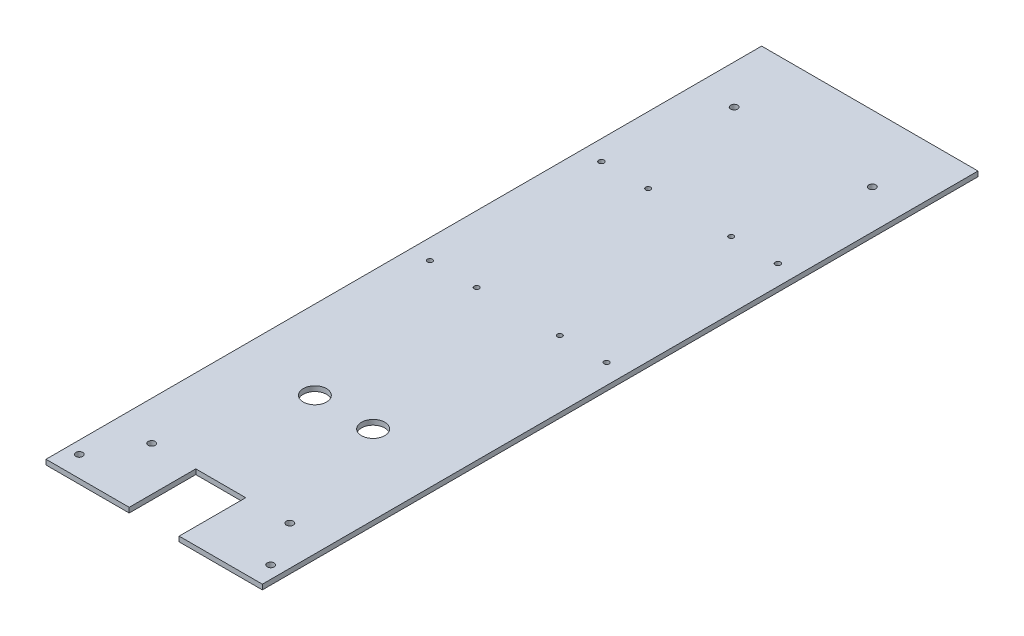
ISO-10303-21;
HEADER;
FILE_DESCRIPTION(('STEP AP214'),'2;1');
FILE_NAME('part.step','',(''),(''),'','','');
FILE_SCHEMA(('AUTOMOTIVE_DESIGN { 1 0 10303 214 1 1 1 1 }'));
ENDSEC;
DATA;
#1=APPLICATION_CONTEXT('core data for automotive mechanical design processes');
#2=APPLICATION_PROTOCOL_DEFINITION('international standard','automotive_design',2000,#1);
#3=PRODUCT_CONTEXT('',#1,'mechanical');
#4=PRODUCT('Part','Part','',(#3));
#5=PRODUCT_RELATED_PRODUCT_CATEGORY('part','',(#4));
#6=PRODUCT_DEFINITION_FORMATION('','',#4);
#7=PRODUCT_DEFINITION_CONTEXT('part definition',#1,'design');
#8=PRODUCT_DEFINITION('design','',#6,#7);
#9=PRODUCT_DEFINITION_SHAPE('','',#8);
#10=(LENGTH_UNIT() NAMED_UNIT(*) SI_UNIT(.MILLI.,.METRE.));
#11=(NAMED_UNIT(*) PLANE_ANGLE_UNIT() SI_UNIT($,.RADIAN.));
#12=(NAMED_UNIT(*) SI_UNIT($,.STERADIAN.) SOLID_ANGLE_UNIT());
#13=UNCERTAINTY_MEASURE_WITH_UNIT(LENGTH_MEASURE(1.E-05),#10,'distance_accuracy_value','');
#14=(GEOMETRIC_REPRESENTATION_CONTEXT(3) GLOBAL_UNCERTAINTY_ASSIGNED_CONTEXT((#13)) GLOBAL_UNIT_ASSIGNED_CONTEXT((#10,
#11,#12)) REPRESENTATION_CONTEXT('',''));
#15=CARTESIAN_POINT('',(0.,0.,0.));
#16=DIRECTION('',(0.,0.,1.));
#17=DIRECTION('',(1.,0.,0.));
#18=AXIS2_PLACEMENT_3D('',#15,#16,#17);
#19=CARTESIAN_POINT('',(-65.,3.,215.));
#20=DIRECTION('',(0.,0.,-1.));
#21=DIRECTION('',(-1.,0.,0.));
#22=AXIS2_PLACEMENT_3D('',#19,#20,#21);
#23=PLANE('',#22);
#24=DIRECTION('',(0.,1.,0.));
#25=VECTOR('',#24,1.);
#26=CARTESIAN_POINT('',(-15.0000000000001,-7.,215.));
#27=LINE('',#26,#25);
#28=CARTESIAN_POINT('',(-15.0000000000001,0.,215.));
#29=VERTEX_POINT('',#28);
#30=CARTESIAN_POINT('',(-15.0000000000001,3.,215.));
#31=VERTEX_POINT('',#30);
#32=EDGE_CURVE('E110',#29,#31,#27,.T.);
#33=ORIENTED_EDGE('',*,*,#32,.T.);
#34=DIRECTION('',(1.,0.,0.));
#35=VECTOR('',#34,1.);
#36=CARTESIAN_POINT('',(-65.,3.,215.));
#37=LINE('',#36,#35);
#38=CARTESIAN_POINT('',(-65.,3.,215.));
#39=VERTEX_POINT('',#38);
#40=EDGE_CURVE('E124',#39,#31,#37,.T.);
#41=ORIENTED_EDGE('',*,*,#40,.F.);
#42=DIRECTION('',(0.,-1.,0.));
#43=VECTOR('',#42,1.);
#44=CARTESIAN_POINT('',(-65.,3.,215.));
#45=LINE('',#44,#43);
#46=CARTESIAN_POINT('',(-65.,0.,215.));
#47=VERTEX_POINT('',#46);
#48=EDGE_CURVE('E135',#39,#47,#45,.T.);
#49=ORIENTED_EDGE('',*,*,#48,.T.);
#50=DIRECTION('',(1.,0.,0.));
#51=VECTOR('',#50,1.);
#52=CARTESIAN_POINT('',(-65.,0.,215.));
#53=LINE('',#52,#51);
#54=EDGE_CURVE('E126',#47,#29,#53,.T.);
#55=ORIENTED_EDGE('',*,*,#54,.T.);
#56=EDGE_LOOP('',(#33,#41,#49,#55));
#57=FACE_BOUND('',#56,.T.);
#58=ADVANCED_FACE('F33',(#57),#23,.F.);
#59=CARTESIAN_POINT('',(0.,3.,0.));
#60=DIRECTION('',(0.,1.,0.));
#61=DIRECTION('',(0.,0.,1.));
#62=AXIS2_PLACEMENT_3D('',#59,#60,#61);
#63=PLANE('',#62);
#64=CARTESIAN_POINT('',(17.4999999999999,3.,100.952208060622));
#65=DIRECTION('',(0.,1.,0.));
#66=DIRECTION('',(0.,0.,1.));
#67=AXIS2_PLACEMENT_3D('',#64,#65,#66);
#68=CIRCLE('',#67,7.);
#69=CARTESIAN_POINT('',(17.4999999999999,3.,107.952208060622));
#70=VERTEX_POINT('',#69);
#71=EDGE_CURVE('E268',#70,#70,#68,.T.);
#72=ORIENTED_EDGE('',*,*,#71,.F.);
#73=EDGE_LOOP('',(#72));
#74=FACE_BOUND('',#73,.T.);
#75=CARTESIAN_POINT('',(-17.5000000000001,3.,100.952208060622));
#76=DIRECTION('',(0.,1.,0.));
#77=DIRECTION('',(0.,0.,1.));
#78=AXIS2_PLACEMENT_3D('',#75,#76,#77);
#79=CIRCLE('',#78,7.);
#80=CARTESIAN_POINT('',(-17.5000000000001,3.,107.952208060622));
#81=VERTEX_POINT('',#80);
#82=EDGE_CURVE('E262',#81,#81,#79,.T.);
#83=ORIENTED_EDGE('',*,*,#82,.F.);
#84=EDGE_LOOP('',(#83));
#85=FACE_BOUND('',#84,.T.);
#86=CARTESIAN_POINT('',(-41.5000000000001,3.,-175.));
#87=DIRECTION('',(0.,1.,0.));
#88=DIRECTION('',(0.,0.,1.));
#89=AXIS2_PLACEMENT_3D('',#86,#87,#88);
#90=CIRCLE('',#89,2.09999999999999);
#91=CARTESIAN_POINT('',(-41.5000000000001,3.,-172.9));
#92=VERTEX_POINT('',#91);
#93=EDGE_CURVE('E256',#92,#92,#90,.T.);
#94=ORIENTED_EDGE('',*,*,#93,.F.);
#95=EDGE_LOOP('',(#94));
#96=FACE_BOUND('',#95,.T.);
#97=CARTESIAN_POINT('',(41.4999999999999,3.,-175.));
#98=DIRECTION('',(0.,1.,0.));
#99=DIRECTION('',(0.,0.,1.));
#100=AXIS2_PLACEMENT_3D('',#97,#98,#99);
#101=CIRCLE('',#100,2.09999999999999);
#102=CARTESIAN_POINT('',(41.4999999999999,3.,-172.9));
#103=VERTEX_POINT('',#102);
#104=EDGE_CURVE('E250',#103,#103,#101,.T.);
#105=ORIENTED_EDGE('',*,*,#104,.F.);
#106=EDGE_LOOP('',(#105));
#107=FACE_BOUND('',#106,.T.);
#108=CARTESIAN_POINT('',(41.5,3.,175.));
#109=DIRECTION('',(0.,1.,0.));
#110=DIRECTION('',(0.,0.,1.));
#111=AXIS2_PLACEMENT_3D('',#108,#109,#110);
#112=CIRCLE('',#111,2.09999999999999);
#113=CARTESIAN_POINT('',(41.5,3.,177.1));
#114=VERTEX_POINT('',#113);
#115=EDGE_CURVE('E244',#114,#114,#112,.T.);
#116=ORIENTED_EDGE('',*,*,#115,.F.);
#117=EDGE_LOOP('',(#116));
#118=FACE_BOUND('',#117,.T.);
#119=CARTESIAN_POINT('',(-41.5,3.,175.));
#120=DIRECTION('',(0.,1.,0.));
#121=DIRECTION('',(0.,0.,1.));
#122=AXIS2_PLACEMENT_3D('',#119,#120,#121);
#123=CIRCLE('',#122,2.09999999999999);
#124=CARTESIAN_POINT('',(-41.5,3.,177.1));
#125=VERTEX_POINT('',#124);
#126=EDGE_CURVE('E238',#125,#125,#123,.T.);
#127=ORIENTED_EDGE('',*,*,#126,.F.);
#128=EDGE_LOOP('',(#127));
#129=FACE_BOUND('',#128,.T.);
#130=CARTESIAN_POINT('',(53.05,3.,-3.75000000000119));
#131=DIRECTION('',(0.,1.,0.));
#132=DIRECTION('',(0.,0.,1.));
#133=AXIS2_PLACEMENT_3D('',#130,#131,#132);
#134=CIRCLE('',#133,1.5);
#135=CARTESIAN_POINT('',(53.05,3.,-2.25000000000118));
#136=VERTEX_POINT('',#135);
#137=EDGE_CURVE('E232',#136,#136,#134,.T.);
#138=ORIENTED_EDGE('',*,*,#137,.F.);
#139=EDGE_LOOP('',(#138));
#140=FACE_BOUND('',#139,.T.);
#141=CARTESIAN_POINT('',(-57.5,3.,202.5));
#142=DIRECTION('',(0.,1.,0.));
#143=DIRECTION('',(0.,0.,1.));
#144=AXIS2_PLACEMENT_3D('',#141,#142,#143);
#145=CIRCLE('',#144,2.09999999999999);
#146=CARTESIAN_POINT('',(-57.5,3.,204.6));
#147=VERTEX_POINT('',#146);
#148=EDGE_CURVE('E226',#147,#147,#145,.T.);
#149=ORIENTED_EDGE('',*,*,#148,.F.);
#150=EDGE_LOOP('',(#149));
#151=FACE_BOUND('',#150,.T.);
#152=CARTESIAN_POINT('',(24.9500000000001,3.,-3.75000000000119));
#153=DIRECTION('',(0.,1.,0.));
#154=DIRECTION('',(0.,0.,1.));
#155=AXIS2_PLACEMENT_3D('',#152,#153,#154);
#156=CIRCLE('',#155,1.5);
#157=CARTESIAN_POINT('',(24.9500000000001,3.,-2.25000000000119));
#158=VERTEX_POINT('',#157);
#159=EDGE_CURVE('E220',#158,#158,#156,.T.);
#160=ORIENTED_EDGE('',*,*,#159,.F.);
#161=EDGE_LOOP('',(#160));
#162=FACE_BOUND('',#161,.T.);
#163=CARTESIAN_POINT('',(53.05,3.,-106.75));
#164=DIRECTION('',(0.,1.,0.));
#165=DIRECTION('',(0.,0.,1.));
#166=AXIS2_PLACEMENT_3D('',#163,#164,#165);
#167=CIRCLE('',#166,1.6);
#168=CARTESIAN_POINT('',(53.05,3.,-105.15));
#169=VERTEX_POINT('',#168);
#170=EDGE_CURVE('E214',#169,#169,#167,.T.);
#171=ORIENTED_EDGE('',*,*,#170,.F.);
#172=EDGE_LOOP('',(#171));
#173=FACE_BOUND('',#172,.T.);
#174=CARTESIAN_POINT('',(57.5,3.,202.5));
#175=DIRECTION('',(0.,1.,0.));
#176=DIRECTION('',(0.,0.,1.));
#177=AXIS2_PLACEMENT_3D('',#174,#175,#176);
#178=CIRCLE('',#177,2.09999999999999);
#179=CARTESIAN_POINT('',(57.5,3.,204.6));
#180=VERTEX_POINT('',#179);
#181=EDGE_CURVE('E208',#180,#180,#178,.T.);
#182=ORIENTED_EDGE('',*,*,#181,.F.);
#183=EDGE_LOOP('',(#182));
#184=FACE_BOUND('',#183,.T.);
#185=CARTESIAN_POINT('',(24.95,3.,-106.75));
#186=DIRECTION('',(0.,1.,0.));
#187=DIRECTION('',(0.,0.,1.));
#188=AXIS2_PLACEMENT_3D('',#185,#186,#187);
#189=CIRCLE('',#188,1.5);
#190=CARTESIAN_POINT('',(24.95,3.,-105.25));
#191=VERTEX_POINT('',#190);
#192=EDGE_CURVE('E202',#191,#191,#189,.T.);
#193=ORIENTED_EDGE('',*,*,#192,.F.);
#194=EDGE_LOOP('',(#193));
#195=FACE_BOUND('',#194,.T.);
#196=CARTESIAN_POINT('',(-24.95,3.,-106.75));
#197=DIRECTION('',(0.,1.,0.));
#198=DIRECTION('',(0.,0.,1.));
#199=AXIS2_PLACEMENT_3D('',#196,#197,#198);
#200=CIRCLE('',#199,1.5);
#201=CARTESIAN_POINT('',(-24.95,3.,-105.25));
#202=VERTEX_POINT('',#201);
#203=EDGE_CURVE('E196',#202,#202,#200,.T.);
#204=ORIENTED_EDGE('',*,*,#203,.F.);
#205=EDGE_LOOP('',(#204));
#206=FACE_BOUND('',#205,.T.);
#207=CARTESIAN_POINT('',(-53.05,3.,-106.75));
#208=DIRECTION('',(0.,1.,0.));
#209=DIRECTION('',(0.,0.,1.));
#210=AXIS2_PLACEMENT_3D('',#207,#208,#209);
#211=CIRCLE('',#210,1.6);
#212=CARTESIAN_POINT('',(-53.05,3.,-105.15));
#213=VERTEX_POINT('',#212);
#214=EDGE_CURVE('E190',#213,#213,#211,.T.);
#215=ORIENTED_EDGE('',*,*,#214,.F.);
#216=EDGE_LOOP('',(#215));
#217=FACE_BOUND('',#216,.T.);
#218=CARTESIAN_POINT('',(-24.9500000000001,3.,-3.75000000000119));
#219=DIRECTION('',(0.,1.,0.));
#220=DIRECTION('',(0.,0.,1.));
#221=AXIS2_PLACEMENT_3D('',#218,#219,#220);
#222=CIRCLE('',#221,1.5);
#223=CARTESIAN_POINT('',(-24.9500000000001,3.,-2.25000000000119));
#224=VERTEX_POINT('',#223);
#225=EDGE_CURVE('E184',#224,#224,#222,.T.);
#226=ORIENTED_EDGE('',*,*,#225,.F.);
#227=EDGE_LOOP('',(#226));
#228=FACE_BOUND('',#227,.T.);
#229=CARTESIAN_POINT('',(-53.05,3.,-3.75000000000119));
#230=DIRECTION('',(0.,1.,0.));
#231=DIRECTION('',(0.,0.,1.));
#232=AXIS2_PLACEMENT_3D('',#229,#230,#231);
#233=CIRCLE('',#232,1.5);
#234=CARTESIAN_POINT('',(-53.05,3.,-2.25000000000118));
#235=VERTEX_POINT('',#234);
#236=EDGE_CURVE('E118',#235,#235,#233,.T.);
#237=ORIENTED_EDGE('',*,*,#236,.F.);
#238=EDGE_LOOP('',(#237));
#239=FACE_BOUND('',#238,.T.);
#240=ORIENTED_EDGE('',*,*,#40,.T.);
#241=DIRECTION('',(0.,0.,-1.));
#242=VECTOR('',#241,1.);
#243=CARTESIAN_POINT('',(-15.0000000000001,3.,215.));
#244=LINE('',#243,#242);
#245=CARTESIAN_POINT('',(-15.0000000000001,3.,175.));
#246=VERTEX_POINT('',#245);
#247=EDGE_CURVE('E107',#31,#246,#244,.T.);
#248=ORIENTED_EDGE('',*,*,#247,.T.);
#249=DIRECTION('',(-1.,0.,0.));
#250=VECTOR('',#249,1.);
#251=CARTESIAN_POINT('',(15.,3.,175.));
#252=LINE('',#251,#250);
#253=CARTESIAN_POINT('',(15.,3.,175.));
#254=VERTEX_POINT('',#253);
#255=EDGE_CURVE('E117',#254,#246,#252,.T.);
#256=ORIENTED_EDGE('',*,*,#255,.F.);
#257=DIRECTION('',(0.,0.,-1.));
#258=VECTOR('',#257,1.);
#259=CARTESIAN_POINT('',(15.,3.,215.));
#260=LINE('',#259,#258);
#261=CARTESIAN_POINT('',(15.,3.,215.));
#262=VERTEX_POINT('',#261);
#263=EDGE_CURVE('E175',#262,#254,#260,.T.);
#264=ORIENTED_EDGE('',*,*,#263,.F.);
#265=CARTESIAN_POINT('',(65.,3.,215.));
#266=VERTEX_POINT('',#265);
#267=EDGE_CURVE('E57',#262,#266,#37,.T.);
#268=ORIENTED_EDGE('',*,*,#267,.T.);
#269=DIRECTION('',(0.,0.,-1.));
#270=VECTOR('',#269,1.);
#271=CARTESIAN_POINT('',(64.9999999999999,3.,-215.));
#272=LINE('',#271,#270);
#273=CARTESIAN_POINT('',(64.9999999999999,3.,-215.));
#274=VERTEX_POINT('',#273);
#275=EDGE_CURVE('E146',#266,#274,#272,.T.);
#276=ORIENTED_EDGE('',*,*,#275,.T.);
#277=DIRECTION('',(-1.,0.,0.));
#278=VECTOR('',#277,1.);
#279=CARTESIAN_POINT('',(-65.0000000000001,3.,-215.));
#280=LINE('',#279,#278);
#281=CARTESIAN_POINT('',(-65.0000000000001,3.,-215.));
#282=VERTEX_POINT('',#281);
#283=EDGE_CURVE('E87',#274,#282,#280,.T.);
#284=ORIENTED_EDGE('',*,*,#283,.T.);
#285=DIRECTION('',(0.,0.,1.));
#286=VECTOR('',#285,1.);
#287=CARTESIAN_POINT('',(-65.0000000000001,3.,-215.));
#288=LINE('',#287,#286);
#289=EDGE_CURVE('E131',#282,#39,#288,.T.);
#290=ORIENTED_EDGE('',*,*,#289,.T.);
#291=EDGE_LOOP('',(#240,#248,#256,#264,#268,#276,#284,#290));
#292=FACE_BOUND('',#291,.T.);
#293=ADVANCED_FACE('F129',(#74,#85,#96,#107,#118,#129,#140,#151,#162,#173,#184,#195,#206,#217,
#228,#239,#292),#63,.T.);
#294=CARTESIAN_POINT('',(0.,0.,0.));
#295=DIRECTION('',(0.,1.,0.));
#296=DIRECTION('',(0.,0.,1.));
#297=AXIS2_PLACEMENT_3D('',#294,#295,#296);
#298=PLANE('',#297);
#299=CARTESIAN_POINT('',(17.4999999999999,0.,100.952208060622));
#300=DIRECTION('',(0.,-1.,0.));
#301=DIRECTION('',(0.,0.,-1.));
#302=AXIS2_PLACEMENT_3D('',#299,#300,#301);
#303=CIRCLE('',#302,7.);
#304=CARTESIAN_POINT('',(17.4999999999999,0.,93.9522080606222));
#305=VERTEX_POINT('',#304);
#306=EDGE_CURVE('E271',#305,#305,#303,.T.);
#307=ORIENTED_EDGE('',*,*,#306,.F.);
#308=EDGE_LOOP('',(#307));
#309=FACE_BOUND('',#308,.T.);
#310=CARTESIAN_POINT('',(-17.5000000000001,0.,100.952208060622));
#311=DIRECTION('',(0.,-1.,0.));
#312=DIRECTION('',(0.,0.,-1.));
#313=AXIS2_PLACEMENT_3D('',#310,#311,#312);
#314=CIRCLE('',#313,7.);
#315=CARTESIAN_POINT('',(-17.5000000000001,0.,93.9522080606222));
#316=VERTEX_POINT('',#315);
#317=EDGE_CURVE('E265',#316,#316,#314,.T.);
#318=ORIENTED_EDGE('',*,*,#317,.F.);
#319=EDGE_LOOP('',(#318));
#320=FACE_BOUND('',#319,.T.);
#321=CARTESIAN_POINT('',(-41.5000000000001,0.,-175.));
#322=DIRECTION('',(0.,-1.,0.));
#323=DIRECTION('',(0.,0.,-1.));
#324=AXIS2_PLACEMENT_3D('',#321,#322,#323);
#325=CIRCLE('',#324,2.09999999999999);
#326=CARTESIAN_POINT('',(-41.5000000000001,0.,-177.1));
#327=VERTEX_POINT('',#326);
#328=EDGE_CURVE('E259',#327,#327,#325,.T.);
#329=ORIENTED_EDGE('',*,*,#328,.F.);
#330=EDGE_LOOP('',(#329));
#331=FACE_BOUND('',#330,.T.);
#332=CARTESIAN_POINT('',(41.4999999999999,0.,-175.));
#333=DIRECTION('',(0.,-1.,0.));
#334=DIRECTION('',(0.,0.,-1.));
#335=AXIS2_PLACEMENT_3D('',#332,#333,#334);
#336=CIRCLE('',#335,2.09999999999999);
#337=CARTESIAN_POINT('',(41.4999999999999,0.,-177.1));
#338=VERTEX_POINT('',#337);
#339=EDGE_CURVE('E253',#338,#338,#336,.T.);
#340=ORIENTED_EDGE('',*,*,#339,.F.);
#341=EDGE_LOOP('',(#340));
#342=FACE_BOUND('',#341,.T.);
#343=CARTESIAN_POINT('',(41.5,0.,175.));
#344=DIRECTION('',(0.,-1.,0.));
#345=DIRECTION('',(0.,0.,-1.));
#346=AXIS2_PLACEMENT_3D('',#343,#344,#345);
#347=CIRCLE('',#346,2.09999999999999);
#348=CARTESIAN_POINT('',(41.5,0.,172.9));
#349=VERTEX_POINT('',#348);
#350=EDGE_CURVE('E247',#349,#349,#347,.T.);
#351=ORIENTED_EDGE('',*,*,#350,.F.);
#352=EDGE_LOOP('',(#351));
#353=FACE_BOUND('',#352,.T.);
#354=CARTESIAN_POINT('',(-41.5,0.,175.));
#355=DIRECTION('',(0.,-1.,0.));
#356=DIRECTION('',(0.,0.,-1.));
#357=AXIS2_PLACEMENT_3D('',#354,#355,#356);
#358=CIRCLE('',#357,2.09999999999999);
#359=CARTESIAN_POINT('',(-41.5,0.,172.9));
#360=VERTEX_POINT('',#359);
#361=EDGE_CURVE('E241',#360,#360,#358,.T.);
#362=ORIENTED_EDGE('',*,*,#361,.F.);
#363=EDGE_LOOP('',(#362));
#364=FACE_BOUND('',#363,.T.);
#365=CARTESIAN_POINT('',(53.05,0.,-3.75000000000119));
#366=DIRECTION('',(0.,-1.,0.));
#367=DIRECTION('',(0.,0.,1.));
#368=AXIS2_PLACEMENT_3D('',#365,#366,#367);
#369=CIRCLE('',#368,1.5);
#370=CARTESIAN_POINT('',(53.05,0.,-2.25000000000118));
#371=VERTEX_POINT('',#370);
#372=EDGE_CURVE('E235',#371,#371,#369,.T.);
#373=ORIENTED_EDGE('',*,*,#372,.F.);
#374=EDGE_LOOP('',(#373));
#375=FACE_BOUND('',#374,.T.);
#376=CARTESIAN_POINT('',(-57.5,0.,202.5));
#377=DIRECTION('',(0.,-1.,0.));
#378=DIRECTION('',(0.,0.,-1.));
#379=AXIS2_PLACEMENT_3D('',#376,#377,#378);
#380=CIRCLE('',#379,2.09999999999999);
#381=CARTESIAN_POINT('',(-57.5,0.,200.4));
#382=VERTEX_POINT('',#381);
#383=EDGE_CURVE('E229',#382,#382,#380,.T.);
#384=ORIENTED_EDGE('',*,*,#383,.F.);
#385=EDGE_LOOP('',(#384));
#386=FACE_BOUND('',#385,.T.);
#387=CARTESIAN_POINT('',(24.9500000000001,0.,-3.75000000000119));
#388=DIRECTION('',(0.,-1.,0.));
#389=DIRECTION('',(0.,0.,1.));
#390=AXIS2_PLACEMENT_3D('',#387,#388,#389);
#391=CIRCLE('',#390,1.5);
#392=CARTESIAN_POINT('',(24.9500000000001,0.,-2.25000000000119));
#393=VERTEX_POINT('',#392);
#394=EDGE_CURVE('E223',#393,#393,#391,.T.);
#395=ORIENTED_EDGE('',*,*,#394,.F.);
#396=EDGE_LOOP('',(#395));
#397=FACE_BOUND('',#396,.T.);
#398=CARTESIAN_POINT('',(53.05,0.,-106.75));
#399=DIRECTION('',(0.,-1.,0.));
#400=DIRECTION('',(0.,0.,1.));
#401=AXIS2_PLACEMENT_3D('',#398,#399,#400);
#402=CIRCLE('',#401,1.6);
#403=CARTESIAN_POINT('',(53.05,0.,-105.15));
#404=VERTEX_POINT('',#403);
#405=EDGE_CURVE('E217',#404,#404,#402,.T.);
#406=ORIENTED_EDGE('',*,*,#405,.F.);
#407=EDGE_LOOP('',(#406));
#408=FACE_BOUND('',#407,.T.);
#409=CARTESIAN_POINT('',(57.5,0.,202.5));
#410=DIRECTION('',(0.,-1.,0.));
#411=DIRECTION('',(0.,0.,-1.));
#412=AXIS2_PLACEMENT_3D('',#409,#410,#411);
#413=CIRCLE('',#412,2.09999999999999);
#414=CARTESIAN_POINT('',(57.5,0.,200.4));
#415=VERTEX_POINT('',#414);
#416=EDGE_CURVE('E211',#415,#415,#413,.T.);
#417=ORIENTED_EDGE('',*,*,#416,.F.);
#418=EDGE_LOOP('',(#417));
#419=FACE_BOUND('',#418,.T.);
#420=CARTESIAN_POINT('',(24.95,0.,-106.75));
#421=DIRECTION('',(0.,-1.,0.));
#422=DIRECTION('',(0.,0.,1.));
#423=AXIS2_PLACEMENT_3D('',#420,#421,#422);
#424=CIRCLE('',#423,1.5);
#425=CARTESIAN_POINT('',(24.95,0.,-105.25));
#426=VERTEX_POINT('',#425);
#427=EDGE_CURVE('E205',#426,#426,#424,.T.);
#428=ORIENTED_EDGE('',*,*,#427,.F.);
#429=EDGE_LOOP('',(#428));
#430=FACE_BOUND('',#429,.T.);
#431=CARTESIAN_POINT('',(-24.95,0.,-106.75));
#432=DIRECTION('',(0.,-1.,0.));
#433=DIRECTION('',(0.,0.,-1.));
#434=AXIS2_PLACEMENT_3D('',#431,#432,#433);
#435=CIRCLE('',#434,1.5);
#436=CARTESIAN_POINT('',(-24.95,0.,-108.25));
#437=VERTEX_POINT('',#436);
#438=EDGE_CURVE('E199',#437,#437,#435,.T.);
#439=ORIENTED_EDGE('',*,*,#438,.F.);
#440=EDGE_LOOP('',(#439));
#441=FACE_BOUND('',#440,.T.);
#442=CARTESIAN_POINT('',(-53.05,0.,-106.75));
#443=DIRECTION('',(0.,-1.,0.));
#444=DIRECTION('',(0.,0.,-1.));
#445=AXIS2_PLACEMENT_3D('',#442,#443,#444);
#446=CIRCLE('',#445,1.6);
#447=CARTESIAN_POINT('',(-53.05,0.,-108.35));
#448=VERTEX_POINT('',#447);
#449=EDGE_CURVE('E193',#448,#448,#446,.T.);
#450=ORIENTED_EDGE('',*,*,#449,.F.);
#451=EDGE_LOOP('',(#450));
#452=FACE_BOUND('',#451,.T.);
#453=CARTESIAN_POINT('',(-24.9500000000001,0.,-3.75000000000119));
#454=DIRECTION('',(0.,-1.,0.));
#455=DIRECTION('',(0.,0.,-1.));
#456=AXIS2_PLACEMENT_3D('',#453,#454,#455);
#457=CIRCLE('',#456,1.5);
#458=CARTESIAN_POINT('',(-24.9500000000001,0.,-5.25000000000119));
#459=VERTEX_POINT('',#458);
#460=EDGE_CURVE('E187',#459,#459,#457,.T.);
#461=ORIENTED_EDGE('',*,*,#460,.F.);
#462=EDGE_LOOP('',(#461));
#463=FACE_BOUND('',#462,.T.);
#464=CARTESIAN_POINT('',(-53.05,0.,-3.75000000000119));
#465=DIRECTION('',(0.,-1.,0.));
#466=DIRECTION('',(0.,0.,-1.));
#467=AXIS2_PLACEMENT_3D('',#464,#465,#466);
#468=CIRCLE('',#467,1.5);
#469=CARTESIAN_POINT('',(-53.05,0.,-5.25000000000119));
#470=VERTEX_POINT('',#469);
#471=EDGE_CURVE('E181',#470,#470,#468,.T.);
#472=ORIENTED_EDGE('',*,*,#471,.F.);
#473=EDGE_LOOP('',(#472));
#474=FACE_BOUND('',#473,.T.);
#475=DIRECTION('',(0.,0.,-1.));
#476=VECTOR('',#475,1.);
#477=CARTESIAN_POINT('',(-15.0000000000001,0.,0.));
#478=LINE('',#477,#476);
#479=CARTESIAN_POINT('',(-15.0000000000001,0.,175.));
#480=VERTEX_POINT('',#479);
#481=EDGE_CURVE('E11',#29,#480,#478,.T.);
#482=ORIENTED_EDGE('',*,*,#481,.F.);
#483=ORIENTED_EDGE('',*,*,#54,.F.);
#484=DIRECTION('',(0.,0.,1.));
#485=VECTOR('',#484,1.);
#486=CARTESIAN_POINT('',(-65.0000000000001,0.,-215.));
#487=LINE('',#486,#485);
#488=CARTESIAN_POINT('',(-65.0000000000001,0.,-215.));
#489=VERTEX_POINT('',#488);
#490=EDGE_CURVE('E144',#489,#47,#487,.T.);
#491=ORIENTED_EDGE('',*,*,#490,.F.);
#492=DIRECTION('',(-1.,0.,0.));
#493=VECTOR('',#492,1.);
#494=CARTESIAN_POINT('',(-65.0000000000001,0.,-215.));
#495=LINE('',#494,#493);
#496=CARTESIAN_POINT('',(64.9999999999999,0.,-215.));
#497=VERTEX_POINT('',#496);
#498=EDGE_CURVE('E142',#497,#489,#495,.T.);
#499=ORIENTED_EDGE('',*,*,#498,.F.);
#500=DIRECTION('',(0.,0.,-1.));
#501=VECTOR('',#500,1.);
#502=CARTESIAN_POINT('',(64.9999999999999,0.,-215.));
#503=LINE('',#502,#501);
#504=CARTESIAN_POINT('',(65.,0.,215.));
#505=VERTEX_POINT('',#504);
#506=EDGE_CURVE('E127',#505,#497,#503,.T.);
#507=ORIENTED_EDGE('',*,*,#506,.F.);
#508=CARTESIAN_POINT('',(15.,0.,215.));
#509=VERTEX_POINT('',#508);
#510=EDGE_CURVE('E79',#509,#505,#53,.T.);
#511=ORIENTED_EDGE('',*,*,#510,.F.);
#512=DIRECTION('',(0.,0.,-1.));
#513=VECTOR('',#512,1.);
#514=CARTESIAN_POINT('',(15.,0.,0.));
#515=LINE('',#514,#513);
#516=CARTESIAN_POINT('',(15.,0.,175.));
#517=VERTEX_POINT('',#516);
#518=EDGE_CURVE('E154',#509,#517,#515,.T.);
#519=ORIENTED_EDGE('',*,*,#518,.T.);
#520=DIRECTION('',(-1.,0.,0.));
#521=VECTOR('',#520,1.);
#522=CARTESIAN_POINT('',(0.,0.,175.));
#523=LINE('',#522,#521);
#524=EDGE_CURVE('E41',#517,#480,#523,.T.);
#525=ORIENTED_EDGE('',*,*,#524,.T.);
#526=EDGE_LOOP('',(#482,#483,#491,#499,#507,#511,#519,#525));
#527=FACE_BOUND('',#526,.T.);
#528=ADVANCED_FACE('F158',(#309,#320,#331,#342,#353,#364,#375,#386,#397,#408,#419,#430,#441,
#452,#463,#474,#527),#298,.F.);
#529=CARTESIAN_POINT('',(64.9999999999999,3.,-215.));
#530=DIRECTION('',(-1.,0.,0.));
#531=DIRECTION('',(0.,0.,1.));
#532=AXIS2_PLACEMENT_3D('',#529,#530,#531);
#533=PLANE('',#532);
#534=ORIENTED_EDGE('',*,*,#506,.T.);
#535=DIRECTION('',(0.,-1.,0.));
#536=VECTOR('',#535,1.);
#537=CARTESIAN_POINT('',(64.9999999999999,3.,-215.));
#538=LINE('',#537,#536);
#539=EDGE_CURVE('E152',#274,#497,#538,.T.);
#540=ORIENTED_EDGE('',*,*,#539,.F.);
#541=ORIENTED_EDGE('',*,*,#275,.F.);
#542=DIRECTION('',(0.,-1.,0.));
#543=VECTOR('',#542,1.);
#544=CARTESIAN_POINT('',(65.,3.,215.));
#545=LINE('',#544,#543);
#546=EDGE_CURVE('E133',#266,#505,#545,.T.);
#547=ORIENTED_EDGE('',*,*,#546,.T.);
#548=EDGE_LOOP('',(#534,#540,#541,#547));
#549=FACE_BOUND('',#548,.T.);
#550=ADVANCED_FACE('F35',(#549),#533,.F.);
#551=CARTESIAN_POINT('',(-65.0000000000001,3.,-215.));
#552=DIRECTION('',(0.,0.,1.));
#553=DIRECTION('',(1.,0.,0.));
#554=AXIS2_PLACEMENT_3D('',#551,#552,#553);
#555=PLANE('',#554);
#556=ORIENTED_EDGE('',*,*,#498,.T.);
#557=DIRECTION('',(0.,-1.,0.));
#558=VECTOR('',#557,1.);
#559=CARTESIAN_POINT('',(-65.0000000000001,3.,-215.));
#560=LINE('',#559,#558);
#561=EDGE_CURVE('E149',#282,#489,#560,.T.);
#562=ORIENTED_EDGE('',*,*,#561,.F.);
#563=ORIENTED_EDGE('',*,*,#283,.F.);
#564=ORIENTED_EDGE('',*,*,#539,.T.);
#565=EDGE_LOOP('',(#556,#562,#563,#564));
#566=FACE_BOUND('',#565,.T.);
#567=ADVANCED_FACE('F168',(#566),#555,.F.);
#568=CARTESIAN_POINT('',(-65.0000000000001,3.,-215.));
#569=DIRECTION('',(1.,0.,0.));
#570=DIRECTION('',(0.,0.,-1.));
#571=AXIS2_PLACEMENT_3D('',#568,#569,#570);
#572=PLANE('',#571);
#573=ORIENTED_EDGE('',*,*,#490,.T.);
#574=ORIENTED_EDGE('',*,*,#48,.F.);
#575=ORIENTED_EDGE('',*,*,#289,.F.);
#576=ORIENTED_EDGE('',*,*,#561,.T.);
#577=EDGE_LOOP('',(#573,#574,#575,#576));
#578=FACE_BOUND('',#577,.T.);
#579=ADVANCED_FACE('F171',(#578),#572,.F.);
#580=ORIENTED_EDGE('',*,*,#267,.F.);
#581=DIRECTION('',(0.,1.,0.));
#582=VECTOR('',#581,1.);
#583=CARTESIAN_POINT('',(15.,-7.,215.));
#584=LINE('',#583,#582);
#585=EDGE_CURVE('E162',#509,#262,#584,.T.);
#586=ORIENTED_EDGE('',*,*,#585,.F.);
#587=ORIENTED_EDGE('',*,*,#510,.T.);
#588=ORIENTED_EDGE('',*,*,#546,.F.);
#589=EDGE_LOOP('',(#580,#586,#587,#588));
#590=FACE_BOUND('',#589,.T.);
#591=ADVANCED_FACE('F174',(#590),#23,.F.);
#592=CARTESIAN_POINT('',(-15.0000000000001,-7.,215.));
#593=DIRECTION('',(1.,0.,0.));
#594=DIRECTION('',(0.,0.,-1.));
#595=AXIS2_PLACEMENT_3D('',#592,#593,#594);
#596=PLANE('',#595);
#597=ORIENTED_EDGE('',*,*,#481,.T.);
#598=DIRECTION('',(0.,1.,0.));
#599=VECTOR('',#598,1.);
#600=CARTESIAN_POINT('',(-15.0000000000001,-7.,175.));
#601=LINE('',#600,#599);
#602=EDGE_CURVE('E113',#480,#246,#601,.T.);
#603=ORIENTED_EDGE('',*,*,#602,.T.);
#604=ORIENTED_EDGE('',*,*,#247,.F.);
#605=ORIENTED_EDGE('',*,*,#32,.F.);
#606=EDGE_LOOP('',(#597,#603,#604,#605));
#607=FACE_BOUND('',#606,.T.);
#608=ADVANCED_FACE('F109',(#607),#596,.T.);
#609=CARTESIAN_POINT('',(15.,-7.,175.));
#610=DIRECTION('',(0.,0.,-1.));
#611=DIRECTION('',(-1.,0.,0.));
#612=AXIS2_PLACEMENT_3D('',#609,#610,#611);
#613=PLANE('',#612);
#614=DIRECTION('',(0.,1.,0.));
#615=VECTOR('',#614,1.);
#616=CARTESIAN_POINT('',(15.,-7.,175.));
#617=LINE('',#616,#615);
#618=EDGE_CURVE('E48',#517,#254,#617,.T.);
#619=ORIENTED_EDGE('',*,*,#618,.T.);
#620=ORIENTED_EDGE('',*,*,#255,.T.);
#621=ORIENTED_EDGE('',*,*,#602,.F.);
#622=ORIENTED_EDGE('',*,*,#524,.F.);
#623=EDGE_LOOP('',(#619,#620,#621,#622));
#624=FACE_BOUND('',#623,.T.);
#625=ADVANCED_FACE('F160',(#624),#613,.F.);
#626=CARTESIAN_POINT('',(15.,-7.,215.));
#627=DIRECTION('',(1.,0.,0.));
#628=DIRECTION('',(0.,0.,-1.));
#629=AXIS2_PLACEMENT_3D('',#626,#627,#628);
#630=PLANE('',#629);
#631=ORIENTED_EDGE('',*,*,#585,.T.);
#632=ORIENTED_EDGE('',*,*,#263,.T.);
#633=ORIENTED_EDGE('',*,*,#618,.F.);
#634=ORIENTED_EDGE('',*,*,#518,.F.);
#635=EDGE_LOOP('',(#631,#632,#633,#634));
#636=FACE_BOUND('',#635,.T.);
#637=ADVANCED_FACE('F313',(#636),#630,.F.);
#638=CARTESIAN_POINT('',(-53.05,10.,-3.75000000000119));
#639=DIRECTION('',(0.,-1.,0.));
#640=DIRECTION('',(0.,0.,-1.));
#641=AXIS2_PLACEMENT_3D('',#638,#639,#640);
#642=CYLINDRICAL_SURFACE('',#641,1.5);
#643=ORIENTED_EDGE('',*,*,#236,.T.);
#644=EDGE_LOOP('',(#643));
#645=FACE_BOUND('',#644,.T.);
#646=ORIENTED_EDGE('',*,*,#471,.T.);
#647=EDGE_LOOP('',(#646));
#648=FACE_BOUND('',#647,.T.);
#649=ADVANCED_FACE('F310',(#645,#648),#642,.F.);
#650=CARTESIAN_POINT('',(-24.9500000000001,10.,-3.75000000000119));
#651=DIRECTION('',(0.,-1.,0.));
#652=DIRECTION('',(0.,0.,-1.));
#653=AXIS2_PLACEMENT_3D('',#650,#651,#652);
#654=CYLINDRICAL_SURFACE('',#653,1.5);
#655=ORIENTED_EDGE('',*,*,#225,.T.);
#656=EDGE_LOOP('',(#655));
#657=FACE_BOUND('',#656,.T.);
#658=ORIENTED_EDGE('',*,*,#460,.T.);
#659=EDGE_LOOP('',(#658));
#660=FACE_BOUND('',#659,.T.);
#661=ADVANCED_FACE('F312',(#657,#660),#654,.F.);
#662=CARTESIAN_POINT('',(-53.05,10.,-106.75));
#663=DIRECTION('',(0.,-1.,0.));
#664=DIRECTION('',(0.,0.,-1.));
#665=AXIS2_PLACEMENT_3D('',#662,#663,#664);
#666=CYLINDRICAL_SURFACE('',#665,1.6);
#667=ORIENTED_EDGE('',*,*,#214,.T.);
#668=EDGE_LOOP('',(#667));
#669=FACE_BOUND('',#668,.T.);
#670=ORIENTED_EDGE('',*,*,#449,.T.);
#671=EDGE_LOOP('',(#670));
#672=FACE_BOUND('',#671,.T.);
#673=ADVANCED_FACE('F320',(#669,#672),#666,.F.);
#674=CARTESIAN_POINT('',(-24.95,10.,-106.75));
#675=DIRECTION('',(0.,-1.,0.));
#676=DIRECTION('',(0.,0.,-1.));
#677=AXIS2_PLACEMENT_3D('',#674,#675,#676);
#678=CYLINDRICAL_SURFACE('',#677,1.5);
#679=ORIENTED_EDGE('',*,*,#203,.T.);
#680=EDGE_LOOP('',(#679));
#681=FACE_BOUND('',#680,.T.);
#682=ORIENTED_EDGE('',*,*,#438,.T.);
#683=EDGE_LOOP('',(#682));
#684=FACE_BOUND('',#683,.T.);
#685=ADVANCED_FACE('F459',(#681,#684),#678,.F.);
#686=CARTESIAN_POINT('',(24.95,10.,-106.75));
#687=DIRECTION('',(0.,-1.,0.));
#688=DIRECTION('',(0.,0.,-1.));
#689=AXIS2_PLACEMENT_3D('',#686,#687,#688);
#690=CYLINDRICAL_SURFACE('',#689,1.5);
#691=ORIENTED_EDGE('',*,*,#192,.T.);
#692=EDGE_LOOP('',(#691));
#693=FACE_BOUND('',#692,.T.);
#694=ORIENTED_EDGE('',*,*,#427,.T.);
#695=EDGE_LOOP('',(#694));
#696=FACE_BOUND('',#695,.T.);
#697=ADVANCED_FACE('F449',(#693,#696),#690,.F.);
#698=CARTESIAN_POINT('',(57.5,10.,202.5));
#699=DIRECTION('',(0.,-1.,0.));
#700=DIRECTION('',(0.,0.,-1.));
#701=AXIS2_PLACEMENT_3D('',#698,#699,#700);
#702=CYLINDRICAL_SURFACE('',#701,2.09999999999999);
#703=ORIENTED_EDGE('',*,*,#181,.T.);
#704=EDGE_LOOP('',(#703));
#705=FACE_BOUND('',#704,.T.);
#706=ORIENTED_EDGE('',*,*,#416,.T.);
#707=EDGE_LOOP('',(#706));
#708=FACE_BOUND('',#707,.T.);
#709=ADVANCED_FACE('F439',(#705,#708),#702,.F.);
#710=CARTESIAN_POINT('',(53.05,10.,-106.75));
#711=DIRECTION('',(0.,-1.,0.));
#712=DIRECTION('',(0.,0.,-1.));
#713=AXIS2_PLACEMENT_3D('',#710,#711,#712);
#714=CYLINDRICAL_SURFACE('',#713,1.6);
#715=ORIENTED_EDGE('',*,*,#170,.T.);
#716=EDGE_LOOP('',(#715));
#717=FACE_BOUND('',#716,.T.);
#718=ORIENTED_EDGE('',*,*,#405,.T.);
#719=EDGE_LOOP('',(#718));
#720=FACE_BOUND('',#719,.T.);
#721=ADVANCED_FACE('F429',(#717,#720),#714,.F.);
#722=CARTESIAN_POINT('',(24.9500000000001,10.,-3.75000000000119));
#723=DIRECTION('',(0.,-1.,0.));
#724=DIRECTION('',(0.,0.,-1.));
#725=AXIS2_PLACEMENT_3D('',#722,#723,#724);
#726=CYLINDRICAL_SURFACE('',#725,1.5);
#727=ORIENTED_EDGE('',*,*,#159,.T.);
#728=EDGE_LOOP('',(#727));
#729=FACE_BOUND('',#728,.T.);
#730=ORIENTED_EDGE('',*,*,#394,.T.);
#731=EDGE_LOOP('',(#730));
#732=FACE_BOUND('',#731,.T.);
#733=ADVANCED_FACE('F419',(#729,#732),#726,.F.);
#734=CARTESIAN_POINT('',(-57.5,10.,202.5));
#735=DIRECTION('',(0.,-1.,0.));
#736=DIRECTION('',(0.,0.,-1.));
#737=AXIS2_PLACEMENT_3D('',#734,#735,#736);
#738=CYLINDRICAL_SURFACE('',#737,2.09999999999999);
#739=ORIENTED_EDGE('',*,*,#148,.T.);
#740=EDGE_LOOP('',(#739));
#741=FACE_BOUND('',#740,.T.);
#742=ORIENTED_EDGE('',*,*,#383,.T.);
#743=EDGE_LOOP('',(#742));
#744=FACE_BOUND('',#743,.T.);
#745=ADVANCED_FACE('F409',(#741,#744),#738,.F.);
#746=CARTESIAN_POINT('',(53.05,10.,-3.75000000000119));
#747=DIRECTION('',(0.,-1.,0.));
#748=DIRECTION('',(0.,0.,-1.));
#749=AXIS2_PLACEMENT_3D('',#746,#747,#748);
#750=CYLINDRICAL_SURFACE('',#749,1.5);
#751=ORIENTED_EDGE('',*,*,#137,.T.);
#752=EDGE_LOOP('',(#751));
#753=FACE_BOUND('',#752,.T.);
#754=ORIENTED_EDGE('',*,*,#372,.T.);
#755=EDGE_LOOP('',(#754));
#756=FACE_BOUND('',#755,.T.);
#757=ADVANCED_FACE('F399',(#753,#756),#750,.F.);
#758=CARTESIAN_POINT('',(-41.5,10.,175.));
#759=DIRECTION('',(0.,-1.,0.));
#760=DIRECTION('',(0.,0.,-1.));
#761=AXIS2_PLACEMENT_3D('',#758,#759,#760);
#762=CYLINDRICAL_SURFACE('',#761,2.09999999999999);
#763=ORIENTED_EDGE('',*,*,#126,.T.);
#764=EDGE_LOOP('',(#763));
#765=FACE_BOUND('',#764,.T.);
#766=ORIENTED_EDGE('',*,*,#361,.T.);
#767=EDGE_LOOP('',(#766));
#768=FACE_BOUND('',#767,.T.);
#769=ADVANCED_FACE('F389',(#765,#768),#762,.F.);
#770=CARTESIAN_POINT('',(41.5,10.,175.));
#771=DIRECTION('',(0.,-1.,0.));
#772=DIRECTION('',(0.,0.,-1.));
#773=AXIS2_PLACEMENT_3D('',#770,#771,#772);
#774=CYLINDRICAL_SURFACE('',#773,2.09999999999999);
#775=ORIENTED_EDGE('',*,*,#115,.T.);
#776=EDGE_LOOP('',(#775));
#777=FACE_BOUND('',#776,.T.);
#778=ORIENTED_EDGE('',*,*,#350,.T.);
#779=EDGE_LOOP('',(#778));
#780=FACE_BOUND('',#779,.T.);
#781=ADVANCED_FACE('F379',(#777,#780),#774,.F.);
#782=CARTESIAN_POINT('',(41.4999999999999,10.,-175.));
#783=DIRECTION('',(0.,-1.,0.));
#784=DIRECTION('',(0.,0.,-1.));
#785=AXIS2_PLACEMENT_3D('',#782,#783,#784);
#786=CYLINDRICAL_SURFACE('',#785,2.09999999999999);
#787=ORIENTED_EDGE('',*,*,#104,.T.);
#788=EDGE_LOOP('',(#787));
#789=FACE_BOUND('',#788,.T.);
#790=ORIENTED_EDGE('',*,*,#339,.T.);
#791=EDGE_LOOP('',(#790));
#792=FACE_BOUND('',#791,.T.);
#793=ADVANCED_FACE('F367',(#789,#792),#786,.F.);
#794=CARTESIAN_POINT('',(-41.5000000000001,10.,-175.));
#795=DIRECTION('',(0.,-1.,0.));
#796=DIRECTION('',(0.,0.,-1.));
#797=AXIS2_PLACEMENT_3D('',#794,#795,#796);
#798=CYLINDRICAL_SURFACE('',#797,2.09999999999999);
#799=ORIENTED_EDGE('',*,*,#93,.T.);
#800=EDGE_LOOP('',(#799));
#801=FACE_BOUND('',#800,.T.);
#802=ORIENTED_EDGE('',*,*,#328,.T.);
#803=EDGE_LOOP('',(#802));
#804=FACE_BOUND('',#803,.T.);
#805=ADVANCED_FACE('F361',(#801,#804),#798,.F.);
#806=CARTESIAN_POINT('',(-17.5000000000001,10.,100.952208060622));
#807=DIRECTION('',(0.,-1.,0.));
#808=DIRECTION('',(0.,0.,-1.));
#809=AXIS2_PLACEMENT_3D('',#806,#807,#808);
#810=CYLINDRICAL_SURFACE('',#809,7.);
#811=ORIENTED_EDGE('',*,*,#82,.T.);
#812=EDGE_LOOP('',(#811));
#813=FACE_BOUND('',#812,.T.);
#814=ORIENTED_EDGE('',*,*,#317,.T.);
#815=EDGE_LOOP('',(#814));
#816=FACE_BOUND('',#815,.T.);
#817=ADVANCED_FACE('F366',(#813,#816),#810,.F.);
#818=CARTESIAN_POINT('',(17.4999999999999,10.,100.952208060622));
#819=DIRECTION('',(0.,-1.,0.));
#820=DIRECTION('',(0.,0.,-1.));
#821=AXIS2_PLACEMENT_3D('',#818,#819,#820);
#822=CYLINDRICAL_SURFACE('',#821,7.);
#823=ORIENTED_EDGE('',*,*,#71,.T.);
#824=EDGE_LOOP('',(#823));
#825=FACE_BOUND('',#824,.T.);
#826=ORIENTED_EDGE('',*,*,#306,.T.);
#827=EDGE_LOOP('',(#826));
#828=FACE_BOUND('',#827,.T.);
#829=ADVANCED_FACE('F275',(#825,#828),#822,.F.);
#830=CLOSED_SHELL('',(#58,#293,#528,#550,#567,#579,#591,#608,#625,#637,#649,#661,#673,#685,#697,
#709,#721,#733,#745,#757,#769,#781,#793,#805,#817,#829));
#831=MANIFOLD_SOLID_BREP('B2',#830);
#832=ADVANCED_BREP_SHAPE_REPRESENTATION('',(#18,#831),#14);
#833=SHAPE_DEFINITION_REPRESENTATION(#9,#832);
ENDSEC;
END-ISO-10303-21;
